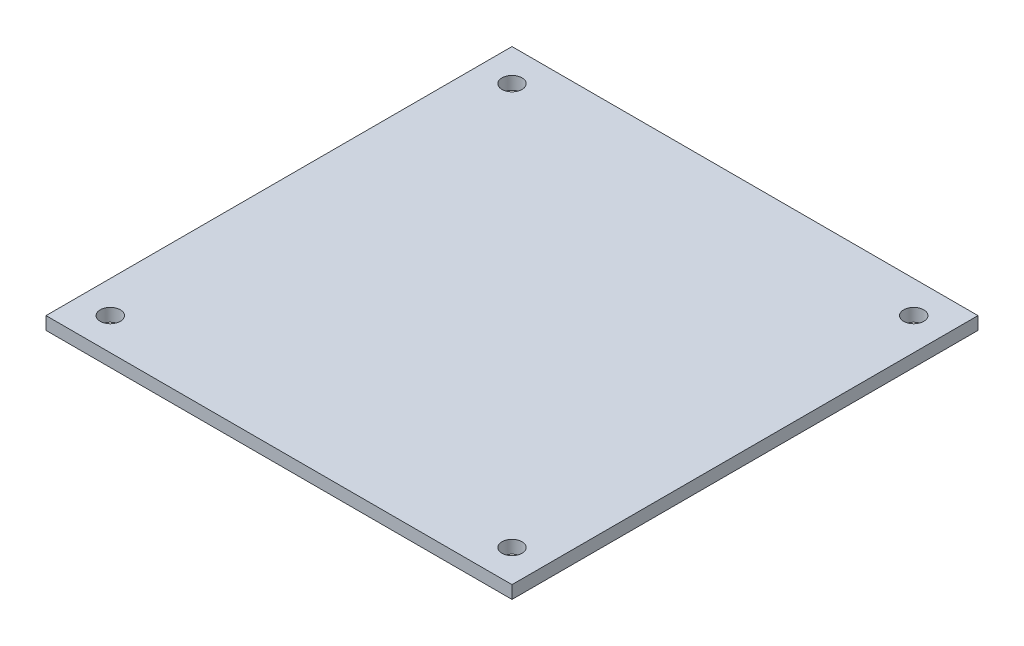
ISO-10303-21;
HEADER;
FILE_DESCRIPTION(('STEP AP214'),'2;1');
FILE_NAME('part.step','',(''),(''),'','','');
FILE_SCHEMA(('AUTOMOTIVE_DESIGN { 1 0 10303 214 1 1 1 1 }'));
ENDSEC;
DATA;
#1=APPLICATION_CONTEXT('core data for automotive mechanical design processes');
#2=APPLICATION_PROTOCOL_DEFINITION('international standard','automotive_design',2000,#1);
#3=PRODUCT_CONTEXT('',#1,'mechanical');
#4=PRODUCT('Part','Part','',(#3));
#5=PRODUCT_RELATED_PRODUCT_CATEGORY('part','',(#4));
#6=PRODUCT_DEFINITION_FORMATION('','',#4);
#7=PRODUCT_DEFINITION_CONTEXT('part definition',#1,'design');
#8=PRODUCT_DEFINITION('design','',#6,#7);
#9=PRODUCT_DEFINITION_SHAPE('','',#8);
#10=(LENGTH_UNIT() NAMED_UNIT(*) SI_UNIT(.MILLI.,.METRE.));
#11=(NAMED_UNIT(*) PLANE_ANGLE_UNIT() SI_UNIT($,.RADIAN.));
#12=(NAMED_UNIT(*) SI_UNIT($,.STERADIAN.) SOLID_ANGLE_UNIT());
#13=UNCERTAINTY_MEASURE_WITH_UNIT(LENGTH_MEASURE(1.E-05),#10,'distance_accuracy_value','');
#14=(GEOMETRIC_REPRESENTATION_CONTEXT(3) GLOBAL_UNCERTAINTY_ASSIGNED_CONTEXT((#13)) GLOBAL_UNIT_ASSIGNED_CONTEXT((#10,
#11,#12)) REPRESENTATION_CONTEXT('',''));
#15=CARTESIAN_POINT('',(0.,0.,0.));
#16=DIRECTION('',(0.,0.,1.));
#17=DIRECTION('',(1.,0.,0.));
#18=AXIS2_PLACEMENT_3D('',#15,#16,#17);
#19=CARTESIAN_POINT('',(-29.,1.6,-29.));
#20=DIRECTION('',(0.,-1.,0.));
#21=DIRECTION('',(0.,0.,-1.));
#22=AXIS2_PLACEMENT_3D('',#19,#20,#21);
#23=PLANE('',#22);
#24=DIRECTION('',(-1.,0.,0.));
#25=VECTOR('',#24,1.);
#26=CARTESIAN_POINT('',(29.,1.6,29.));
#27=LINE('',#26,#25);
#28=CARTESIAN_POINT('',(-29.,1.6,29.));
#29=VERTEX_POINT('',#28);
#30=CARTESIAN_POINT('',(29.,1.6,29.));
#31=VERTEX_POINT('',#30);
#32=EDGE_CURVE('E227',#29,#31,#27,.F.);
#33=ORIENTED_EDGE('',*,*,#32,.T.);
#34=DIRECTION('',(0.,0.,1.));
#35=VECTOR('',#34,1.);
#36=CARTESIAN_POINT('',(29.,1.6,-29.));
#37=LINE('',#36,#35);
#38=CARTESIAN_POINT('',(29.,1.6,-29.));
#39=VERTEX_POINT('',#38);
#40=EDGE_CURVE('E54',#31,#39,#37,.F.);
#41=ORIENTED_EDGE('',*,*,#40,.T.);
#42=DIRECTION('',(1.,0.,0.));
#43=VECTOR('',#42,1.);
#44=CARTESIAN_POINT('',(-29.,1.6,-29.));
#45=LINE('',#44,#43);
#46=CARTESIAN_POINT('',(-29.,1.6,-29.));
#47=VERTEX_POINT('',#46);
#48=EDGE_CURVE('E56',#39,#47,#45,.F.);
#49=ORIENTED_EDGE('',*,*,#48,.T.);
#50=DIRECTION('',(0.,0.,-1.));
#51=VECTOR('',#50,1.);
#52=CARTESIAN_POINT('',(-29.,1.6,29.));
#53=LINE('',#52,#51);
#54=EDGE_CURVE('E59',#47,#29,#53,.F.);
#55=ORIENTED_EDGE('',*,*,#54,.T.);
#56=EDGE_LOOP('',(#33,#41,#49,#55));
#57=FACE_BOUND('',#56,.T.);
#58=CARTESIAN_POINT('',(25.,1.6,25.));
#59=DIRECTION('',(0.,-1.,0.));
#60=DIRECTION('',(0.,0.,-1.));
#61=AXIS2_PLACEMENT_3D('',#58,#59,#60);
#62=CIRCLE('',#61,1.25);
#63=CARTESIAN_POINT('',(25.,1.6,23.75));
#64=VERTEX_POINT('',#63);
#65=EDGE_CURVE('E72',#64,#64,#62,.T.);
#66=ORIENTED_EDGE('',*,*,#65,.T.);
#67=EDGE_LOOP('',(#66));
#68=FACE_BOUND('',#67,.T.);
#69=CARTESIAN_POINT('',(25.,1.6,-25.));
#70=DIRECTION('',(0.,-1.,0.));
#71=DIRECTION('',(0.,0.,-1.));
#72=AXIS2_PLACEMENT_3D('',#69,#70,#71);
#73=CIRCLE('',#72,1.25);
#74=CARTESIAN_POINT('',(25.,1.6,-26.25));
#75=VERTEX_POINT('',#74);
#76=EDGE_CURVE('E98',#75,#75,#73,.T.);
#77=ORIENTED_EDGE('',*,*,#76,.T.);
#78=EDGE_LOOP('',(#77));
#79=FACE_BOUND('',#78,.T.);
#80=CARTESIAN_POINT('',(-25.,1.6,25.));
#81=DIRECTION('',(0.,-1.,0.));
#82=DIRECTION('',(0.,0.,-1.));
#83=AXIS2_PLACEMENT_3D('',#80,#81,#82);
#84=CIRCLE('',#83,1.25);
#85=CARTESIAN_POINT('',(-25.,1.6,23.75));
#86=VERTEX_POINT('',#85);
#87=EDGE_CURVE('E100',#86,#86,#84,.T.);
#88=ORIENTED_EDGE('',*,*,#87,.T.);
#89=EDGE_LOOP('',(#88));
#90=FACE_BOUND('',#89,.T.);
#91=CARTESIAN_POINT('',(-25.,1.6,-25.));
#92=DIRECTION('',(0.,-1.,0.));
#93=DIRECTION('',(0.,0.,-1.));
#94=AXIS2_PLACEMENT_3D('',#91,#92,#93);
#95=CIRCLE('',#94,1.25);
#96=CARTESIAN_POINT('',(-25.,1.6,-26.25));
#97=VERTEX_POINT('',#96);
#98=EDGE_CURVE('E19',#97,#97,#95,.T.);
#99=ORIENTED_EDGE('',*,*,#98,.T.);
#100=EDGE_LOOP('',(#99));
#101=FACE_BOUND('',#100,.T.);
#102=ADVANCED_FACE('F16',(#57,#68,#79,#90,#101),#23,.F.);
#103=CARTESIAN_POINT('',(-25.,5.13553390593274,-25.));
#104=DIRECTION('',(0.,-1.,0.));
#105=DIRECTION('',(0.,0.,-1.));
#106=AXIS2_PLACEMENT_3D('',#103,#104,#105);
#107=CYLINDRICAL_SURFACE('',#106,1.25);
#108=CARTESIAN_POINT('',(-25.,0.,-25.));
#109=DIRECTION('',(0.,-1.,0.));
#110=DIRECTION('',(0.,0.,-1.));
#111=AXIS2_PLACEMENT_3D('',#108,#109,#110);
#112=CIRCLE('',#111,1.25);
#113=CARTESIAN_POINT('',(-25.,0.,-26.25));
#114=VERTEX_POINT('',#113);
#115=EDGE_CURVE('E93',#114,#114,#112,.F.);
#116=ORIENTED_EDGE('',*,*,#115,.F.);
#117=EDGE_LOOP('',(#116));
#118=FACE_BOUND('',#117,.T.);
#119=ORIENTED_EDGE('',*,*,#98,.F.);
#120=EDGE_LOOP('',(#119));
#121=FACE_BOUND('',#120,.T.);
#122=ADVANCED_FACE('F108',(#118,#121),#107,.F.);
#123=CARTESIAN_POINT('',(-25.,5.13553390593274,25.));
#124=DIRECTION('',(0.,-1.,0.));
#125=DIRECTION('',(0.,0.,-1.));
#126=AXIS2_PLACEMENT_3D('',#123,#124,#125);
#127=CYLINDRICAL_SURFACE('',#126,1.25);
#128=CARTESIAN_POINT('',(-25.,0.,25.));
#129=DIRECTION('',(0.,-1.,0.));
#130=DIRECTION('',(0.,0.,-1.));
#131=AXIS2_PLACEMENT_3D('',#128,#129,#130);
#132=CIRCLE('',#131,1.25);
#133=CARTESIAN_POINT('',(-25.,0.,23.75));
#134=VERTEX_POINT('',#133);
#135=EDGE_CURVE('E90',#134,#134,#132,.F.);
#136=ORIENTED_EDGE('',*,*,#135,.F.);
#137=EDGE_LOOP('',(#136));
#138=FACE_BOUND('',#137,.T.);
#139=ORIENTED_EDGE('',*,*,#87,.F.);
#140=EDGE_LOOP('',(#139));
#141=FACE_BOUND('',#140,.T.);
#142=ADVANCED_FACE('F110',(#138,#141),#127,.F.);
#143=CARTESIAN_POINT('',(25.,5.13553390593274,-25.));
#144=DIRECTION('',(0.,-1.,0.));
#145=DIRECTION('',(0.,0.,-1.));
#146=AXIS2_PLACEMENT_3D('',#143,#144,#145);
#147=CYLINDRICAL_SURFACE('',#146,1.25);
#148=CARTESIAN_POINT('',(25.,0.,-25.));
#149=DIRECTION('',(0.,-1.,0.));
#150=DIRECTION('',(0.,0.,-1.));
#151=AXIS2_PLACEMENT_3D('',#148,#149,#150);
#152=CIRCLE('',#151,1.25);
#153=CARTESIAN_POINT('',(25.,0.,-26.25));
#154=VERTEX_POINT('',#153);
#155=EDGE_CURVE('E87',#154,#154,#152,.F.);
#156=ORIENTED_EDGE('',*,*,#155,.F.);
#157=EDGE_LOOP('',(#156));
#158=FACE_BOUND('',#157,.T.);
#159=ORIENTED_EDGE('',*,*,#76,.F.);
#160=EDGE_LOOP('',(#159));
#161=FACE_BOUND('',#160,.T.);
#162=ADVANCED_FACE('F117',(#158,#161),#147,.F.);
#163=CARTESIAN_POINT('',(25.,5.13553390593274,25.));
#164=DIRECTION('',(0.,-1.,0.));
#165=DIRECTION('',(0.,0.,-1.));
#166=AXIS2_PLACEMENT_3D('',#163,#164,#165);
#167=CYLINDRICAL_SURFACE('',#166,1.25);
#168=CARTESIAN_POINT('',(25.,0.,25.));
#169=DIRECTION('',(0.,-1.,0.));
#170=DIRECTION('',(0.,0.,-1.));
#171=AXIS2_PLACEMENT_3D('',#168,#169,#170);
#172=CIRCLE('',#171,1.25);
#173=CARTESIAN_POINT('',(25.,0.,23.75));
#174=VERTEX_POINT('',#173);
#175=EDGE_CURVE('E83',#174,#174,#172,.F.);
#176=ORIENTED_EDGE('',*,*,#175,.F.);
#177=EDGE_LOOP('',(#176));
#178=FACE_BOUND('',#177,.T.);
#179=ORIENTED_EDGE('',*,*,#65,.F.);
#180=EDGE_LOOP('',(#179));
#181=FACE_BOUND('',#180,.T.);
#182=ADVANCED_FACE('F142',(#178,#181),#167,.F.);
#183=CARTESIAN_POINT('',(-29.,1.6,29.));
#184=DIRECTION('',(1.,0.,0.));
#185=DIRECTION('',(0.,0.,-1.));
#186=AXIS2_PLACEMENT_3D('',#183,#184,#185);
#187=PLANE('',#186);
#188=DIRECTION('',(0.,1.,0.));
#189=VECTOR('',#188,1.);
#190=CARTESIAN_POINT('',(-29.,1.6,29.));
#191=LINE('',#190,#189);
#192=CARTESIAN_POINT('',(-29.,0.,29.));
#193=VERTEX_POINT('',#192);
#194=EDGE_CURVE('E70',#193,#29,#191,.T.);
#195=ORIENTED_EDGE('',*,*,#194,.T.);
#196=ORIENTED_EDGE('',*,*,#54,.F.);
#197=DIRECTION('',(0.,1.,0.));
#198=VECTOR('',#197,1.);
#199=CARTESIAN_POINT('',(-29.,1.6,-29.));
#200=LINE('',#199,#198);
#201=CARTESIAN_POINT('',(-29.,0.,-29.));
#202=VERTEX_POINT('',#201);
#203=EDGE_CURVE('E64',#47,#202,#200,.F.);
#204=ORIENTED_EDGE('',*,*,#203,.T.);
#205=DIRECTION('',(0.,0.,-1.));
#206=VECTOR('',#205,1.);
#207=CARTESIAN_POINT('',(-29.,0.,-29.));
#208=LINE('',#207,#206);
#209=EDGE_CURVE('E86',#193,#202,#208,.T.);
#210=ORIENTED_EDGE('',*,*,#209,.F.);
#211=EDGE_LOOP('',(#195,#196,#204,#210));
#212=FACE_BOUND('',#211,.T.);
#213=ADVANCED_FACE('F67',(#212),#187,.F.);
#214=CARTESIAN_POINT('',(-29.,1.6,-29.));
#215=DIRECTION('',(0.,0.,1.));
#216=DIRECTION('',(1.,0.,0.));
#217=AXIS2_PLACEMENT_3D('',#214,#215,#216);
#218=PLANE('',#217);
#219=ORIENTED_EDGE('',*,*,#203,.F.);
#220=ORIENTED_EDGE('',*,*,#48,.F.);
#221=DIRECTION('',(0.,1.,0.));
#222=VECTOR('',#221,1.);
#223=CARTESIAN_POINT('',(29.,1.6,-29.));
#224=LINE('',#223,#222);
#225=CARTESIAN_POINT('',(29.,0.,-29.));
#226=VERTEX_POINT('',#225);
#227=EDGE_CURVE('E79',#39,#226,#224,.F.);
#228=ORIENTED_EDGE('',*,*,#227,.T.);
#229=DIRECTION('',(1.,0.,0.));
#230=VECTOR('',#229,1.);
#231=CARTESIAN_POINT('',(-29.,0.,-29.));
#232=LINE('',#231,#230);
#233=EDGE_CURVE('E76',#202,#226,#232,.T.);
#234=ORIENTED_EDGE('',*,*,#233,.F.);
#235=EDGE_LOOP('',(#219,#220,#228,#234));
#236=FACE_BOUND('',#235,.T.);
#237=ADVANCED_FACE('F74',(#236),#218,.F.);
#238=CARTESIAN_POINT('',(29.,1.6,-29.));
#239=DIRECTION('',(-1.,0.,0.));
#240=DIRECTION('',(0.,0.,1.));
#241=AXIS2_PLACEMENT_3D('',#238,#239,#240);
#242=PLANE('',#241);
#243=ORIENTED_EDGE('',*,*,#227,.F.);
#244=ORIENTED_EDGE('',*,*,#40,.F.);
#245=DIRECTION('',(0.,1.,0.));
#246=VECTOR('',#245,1.);
#247=CARTESIAN_POINT('',(29.,1.6,29.));
#248=LINE('',#247,#246);
#249=CARTESIAN_POINT('',(29.,0.,29.));
#250=VERTEX_POINT('',#249);
#251=EDGE_CURVE('E34',#31,#250,#248,.F.);
#252=ORIENTED_EDGE('',*,*,#251,.T.);
#253=DIRECTION('',(0.,0.,-1.));
#254=VECTOR('',#253,1.);
#255=CARTESIAN_POINT('',(29.,0.,-29.));
#256=LINE('',#255,#254);
#257=EDGE_CURVE('E25',#226,#250,#256,.F.);
#258=ORIENTED_EDGE('',*,*,#257,.F.);
#259=EDGE_LOOP('',(#243,#244,#252,#258));
#260=FACE_BOUND('',#259,.T.);
#261=ADVANCED_FACE('F130',(#260),#242,.F.);
#262=CARTESIAN_POINT('',(29.,1.6,29.));
#263=DIRECTION('',(0.,0.,-1.));
#264=DIRECTION('',(-1.,0.,0.));
#265=AXIS2_PLACEMENT_3D('',#262,#263,#264);
#266=PLANE('',#265);
#267=ORIENTED_EDGE('',*,*,#251,.F.);
#268=ORIENTED_EDGE('',*,*,#32,.F.);
#269=ORIENTED_EDGE('',*,*,#194,.F.);
#270=DIRECTION('',(1.,0.,0.));
#271=VECTOR('',#270,1.);
#272=CARTESIAN_POINT('',(-29.,0.,29.));
#273=LINE('',#272,#271);
#274=EDGE_CURVE('E11',#250,#193,#273,.F.);
#275=ORIENTED_EDGE('',*,*,#274,.F.);
#276=EDGE_LOOP('',(#267,#268,#269,#275));
#277=FACE_BOUND('',#276,.T.);
#278=ADVANCED_FACE('F124',(#277),#266,.F.);
#279=CARTESIAN_POINT('',(-29.,0.,-29.));
#280=DIRECTION('',(0.,-1.,0.));
#281=DIRECTION('',(0.,0.,-1.));
#282=AXIS2_PLACEMENT_3D('',#279,#280,#281);
#283=PLANE('',#282);
#284=ORIENTED_EDGE('',*,*,#257,.T.);
#285=ORIENTED_EDGE('',*,*,#274,.T.);
#286=ORIENTED_EDGE('',*,*,#209,.T.);
#287=ORIENTED_EDGE('',*,*,#233,.T.);
#288=EDGE_LOOP('',(#284,#285,#286,#287));
#289=FACE_BOUND('',#288,.T.);
#290=ORIENTED_EDGE('',*,*,#175,.T.);
#291=EDGE_LOOP('',(#290));
#292=FACE_BOUND('',#291,.T.);
#293=ORIENTED_EDGE('',*,*,#155,.T.);
#294=EDGE_LOOP('',(#293));
#295=FACE_BOUND('',#294,.T.);
#296=ORIENTED_EDGE('',*,*,#135,.T.);
#297=EDGE_LOOP('',(#296));
#298=FACE_BOUND('',#297,.T.);
#299=ORIENTED_EDGE('',*,*,#115,.T.);
#300=EDGE_LOOP('',(#299));
#301=FACE_BOUND('',#300,.T.);
#302=ADVANCED_FACE('F122',(#289,#292,#295,#298,#301),#283,.T.);
#303=CLOSED_SHELL('',(#102,#122,#142,#162,#182,#213,#237,#261,#278,#302));
#304=MANIFOLD_SOLID_BREP('B1',#303);
#305=ADVANCED_BREP_SHAPE_REPRESENTATION('',(#18,#304),#14);
#306=SHAPE_DEFINITION_REPRESENTATION(#9,#305);
ENDSEC;
END-ISO-10303-21;
